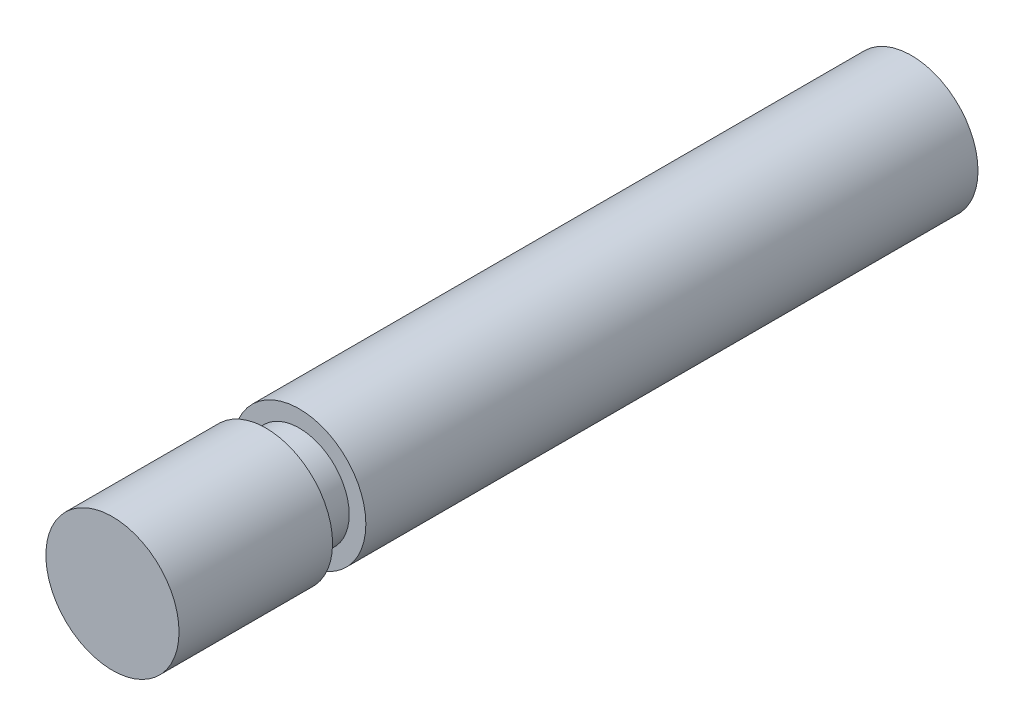
ISO-10303-21;
HEADER;
FILE_DESCRIPTION(('STEP AP214'),'2;1');
FILE_NAME('part.step','',(''),(''),'','','');
FILE_SCHEMA(('AUTOMOTIVE_DESIGN { 1 0 10303 214 1 1 1 1 }'));
ENDSEC;
DATA;
#1=APPLICATION_CONTEXT('core data for automotive mechanical design processes');
#2=APPLICATION_PROTOCOL_DEFINITION('international standard','automotive_design',2000,#1);
#3=PRODUCT_CONTEXT('',#1,'mechanical');
#4=PRODUCT('Part','Part','',(#3));
#5=PRODUCT_RELATED_PRODUCT_CATEGORY('part','',(#4));
#6=PRODUCT_DEFINITION_FORMATION('','',#4);
#7=PRODUCT_DEFINITION_CONTEXT('part definition',#1,'design');
#8=PRODUCT_DEFINITION('design','',#6,#7);
#9=PRODUCT_DEFINITION_SHAPE('','',#8);
#10=(LENGTH_UNIT() NAMED_UNIT(*) SI_UNIT(.MILLI.,.METRE.));
#11=(NAMED_UNIT(*) PLANE_ANGLE_UNIT() SI_UNIT($,.RADIAN.));
#12=(NAMED_UNIT(*) SI_UNIT($,.STERADIAN.) SOLID_ANGLE_UNIT());
#13=UNCERTAINTY_MEASURE_WITH_UNIT(LENGTH_MEASURE(1.E-05),#10,'distance_accuracy_value','');
#14=(GEOMETRIC_REPRESENTATION_CONTEXT(3) GLOBAL_UNCERTAINTY_ASSIGNED_CONTEXT((#13)) GLOBAL_UNIT_ASSIGNED_CONTEXT((#10,
#11,#12)) REPRESENTATION_CONTEXT('',''));
#15=CARTESIAN_POINT('',(0.,0.,0.));
#16=DIRECTION('',(0.,0.,1.));
#17=DIRECTION('',(1.,0.,0.));
#18=AXIS2_PLACEMENT_3D('',#15,#16,#17);
#19=CARTESIAN_POINT('',(0.,0.,-600.));
#20=DIRECTION('',(0.,0.,1.));
#21=DIRECTION('',(1.,0.,0.));
#22=AXIS2_PLACEMENT_3D('',#19,#20,#21);
#23=PLANE('',#22);
#24=CARTESIAN_POINT('',(0.,0.,-600.));
#25=DIRECTION('',(0.,0.,1.));
#26=DIRECTION('',(1.,0.,0.));
#27=AXIS2_PLACEMENT_3D('',#24,#25,#26);
#28=CIRCLE('',#27,50.);
#29=CARTESIAN_POINT('',(50.,0.,-600.));
#30=VERTEX_POINT('',#29);
#31=EDGE_CURVE('E10',#30,#30,#28,.T.);
#32=ORIENTED_EDGE('',*,*,#31,.F.);
#33=EDGE_LOOP('',(#32));
#34=FACE_BOUND('',#33,.T.);
#35=ADVANCED_FACE('F31',(#34),#23,.F.);
#36=CARTESIAN_POINT('',(0.,0.,0.));
#37=DIRECTION('',(0.,0.,1.));
#38=DIRECTION('',(1.,0.,0.));
#39=AXIS2_PLACEMENT_3D('',#36,#37,#38);
#40=CYLINDRICAL_SURFACE('',#39,50.);
#41=CARTESIAN_POINT('',(0.,0.,-140.3));
#42=DIRECTION('',(0.,0.,1.));
#43=DIRECTION('',(1.,0.,0.));
#44=AXIS2_PLACEMENT_3D('',#41,#42,#43);
#45=CIRCLE('',#44,50.);
#46=CARTESIAN_POINT('',(50.,0.,-140.3));
#47=VERTEX_POINT('',#46);
#48=EDGE_CURVE('E37',#47,#47,#45,.T.);
#49=ORIENTED_EDGE('',*,*,#48,.F.);
#50=EDGE_LOOP('',(#49));
#51=FACE_BOUND('',#50,.T.);
#52=ORIENTED_EDGE('',*,*,#31,.T.);
#53=EDGE_LOOP('',(#52));
#54=FACE_BOUND('',#53,.T.);
#55=ADVANCED_FACE('F79',(#51,#54),#40,.T.);
#56=CARTESIAN_POINT('',(0.,37.5,-140.3));
#57=DIRECTION('',(0.,0.,-1.));
#58=DIRECTION('',(-1.,0.,0.));
#59=AXIS2_PLACEMENT_3D('',#56,#57,#58);
#60=PLANE('',#59);
#61=CARTESIAN_POINT('',(0.,0.,-140.3));
#62=DIRECTION('',(0.,0.,1.));
#63=DIRECTION('',(1.,0.,0.));
#64=AXIS2_PLACEMENT_3D('',#61,#62,#63);
#65=CIRCLE('',#64,37.5);
#66=CARTESIAN_POINT('',(37.5,0.,-140.3));
#67=VERTEX_POINT('',#66);
#68=EDGE_CURVE('E41',#67,#67,#65,.T.);
#69=ORIENTED_EDGE('',*,*,#68,.F.);
#70=EDGE_LOOP('',(#69));
#71=FACE_BOUND('',#70,.T.);
#72=ORIENTED_EDGE('',*,*,#48,.T.);
#73=EDGE_LOOP('',(#72));
#74=FACE_BOUND('',#73,.T.);
#75=ADVANCED_FACE('F74',(#71,#74),#60,.F.);
#76=CARTESIAN_POINT('',(0.,0.,0.));
#77=DIRECTION('',(0.,0.,1.));
#78=DIRECTION('',(1.,0.,0.));
#79=AXIS2_PLACEMENT_3D('',#76,#77,#78);
#80=CYLINDRICAL_SURFACE('',#79,37.5);
#81=CARTESIAN_POINT('',(0.,0.,-115.3));
#82=DIRECTION('',(0.,0.,1.));
#83=DIRECTION('',(1.,0.,0.));
#84=AXIS2_PLACEMENT_3D('',#81,#82,#83);
#85=CIRCLE('',#84,37.5);
#86=CARTESIAN_POINT('',(37.5,0.,-115.3));
#87=VERTEX_POINT('',#86);
#88=EDGE_CURVE('E45',#87,#87,#85,.T.);
#89=ORIENTED_EDGE('',*,*,#88,.F.);
#90=EDGE_LOOP('',(#89));
#91=FACE_BOUND('',#90,.T.);
#92=ORIENTED_EDGE('',*,*,#68,.T.);
#93=EDGE_LOOP('',(#92));
#94=FACE_BOUND('',#93,.T.);
#95=ADVANCED_FACE('F68',(#91,#94),#80,.T.);
#96=CARTESIAN_POINT('',(0.,50.,-115.3));
#97=DIRECTION('',(0.,0.,1.));
#98=DIRECTION('',(1.,0.,0.));
#99=AXIS2_PLACEMENT_3D('',#96,#97,#98);
#100=PLANE('',#99);
#101=CARTESIAN_POINT('',(0.,0.,-115.3));
#102=DIRECTION('',(0.,0.,1.));
#103=DIRECTION('',(1.,0.,0.));
#104=AXIS2_PLACEMENT_3D('',#101,#102,#103);
#105=CIRCLE('',#104,50.);
#106=CARTESIAN_POINT('',(50.,0.,-115.3));
#107=VERTEX_POINT('',#106);
#108=EDGE_CURVE('E50',#107,#107,#105,.T.);
#109=ORIENTED_EDGE('',*,*,#108,.F.);
#110=EDGE_LOOP('',(#109));
#111=FACE_BOUND('',#110,.T.);
#112=ORIENTED_EDGE('',*,*,#88,.T.);
#113=EDGE_LOOP('',(#112));
#114=FACE_BOUND('',#113,.T.);
#115=ADVANCED_FACE('F62',(#111,#114),#100,.F.);
#116=CARTESIAN_POINT('',(0.,0.,0.));
#117=DIRECTION('',(0.,0.,1.));
#118=DIRECTION('',(1.,0.,0.));
#119=AXIS2_PLACEMENT_3D('',#116,#117,#118);
#120=CYLINDRICAL_SURFACE('',#119,50.);
#121=CARTESIAN_POINT('',(0.,0.,0.));
#122=DIRECTION('',(0.,0.,1.));
#123=DIRECTION('',(1.,0.,0.));
#124=AXIS2_PLACEMENT_3D('',#121,#122,#123);
#125=CIRCLE('',#124,50.);
#126=CARTESIAN_POINT('',(50.,0.,0.));
#127=VERTEX_POINT('',#126);
#128=EDGE_CURVE('E53',#127,#127,#125,.T.);
#129=ORIENTED_EDGE('',*,*,#128,.F.);
#130=EDGE_LOOP('',(#129));
#131=FACE_BOUND('',#130,.T.);
#132=ORIENTED_EDGE('',*,*,#108,.T.);
#133=EDGE_LOOP('',(#132));
#134=FACE_BOUND('',#133,.T.);
#135=ADVANCED_FACE('F59',(#131,#134),#120,.T.);
#136=CARTESIAN_POINT('',(0.,0.,0.));
#137=DIRECTION('',(0.,0.,-1.));
#138=DIRECTION('',(-1.,0.,0.));
#139=AXIS2_PLACEMENT_3D('',#136,#137,#138);
#140=PLANE('',#139);
#141=ORIENTED_EDGE('',*,*,#128,.T.);
#142=EDGE_LOOP('',(#141));
#143=FACE_BOUND('',#142,.T.);
#144=ADVANCED_FACE('F57',(#143),#140,.F.);
#145=CLOSED_SHELL('',(#35,#55,#75,#95,#115,#135,#144));
#146=MANIFOLD_SOLID_BREP('B2',#145);
#147=ADVANCED_BREP_SHAPE_REPRESENTATION('',(#18,#146),#14);
#148=SHAPE_DEFINITION_REPRESENTATION(#9,#147);
ENDSEC;
END-ISO-10303-21;
